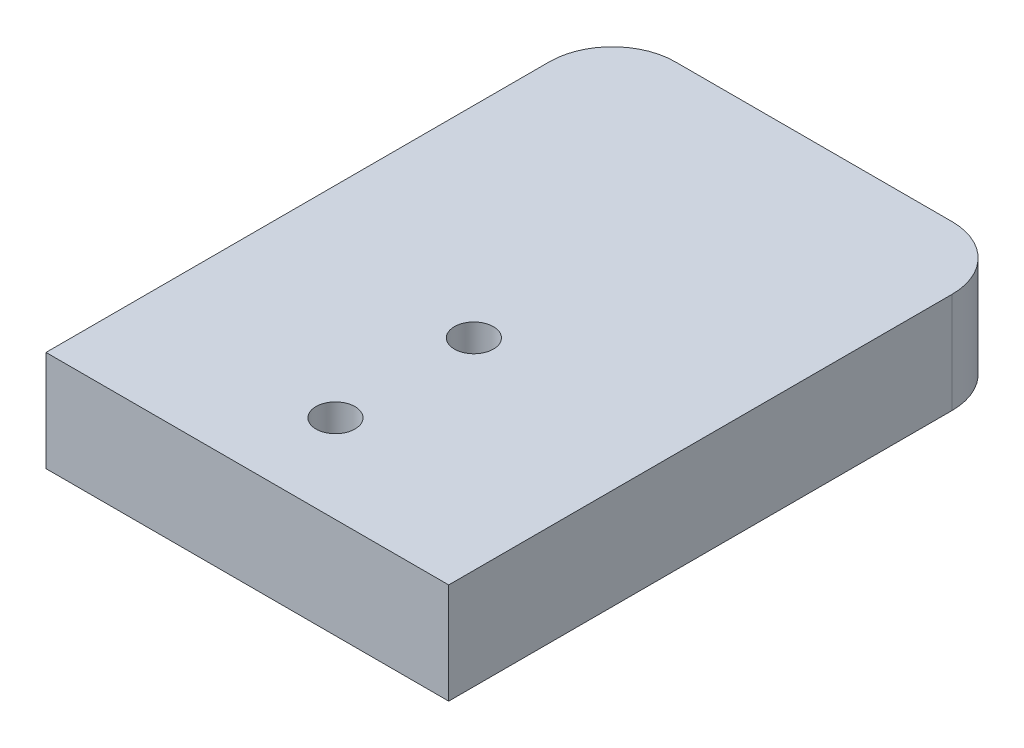
ISO-10303-21;
HEADER;
FILE_DESCRIPTION(('STEP AP214'),'2;1');
FILE_NAME('part.step','',(''),(''),'','','');
FILE_SCHEMA(('AUTOMOTIVE_DESIGN { 1 0 10303 214 1 1 1 1 }'));
ENDSEC;
DATA;
#1=APPLICATION_CONTEXT('core data for automotive mechanical design processes');
#2=APPLICATION_PROTOCOL_DEFINITION('international standard','automotive_design',2000,#1);
#3=PRODUCT_CONTEXT('',#1,'mechanical');
#4=PRODUCT('Part','Part','',(#3));
#5=PRODUCT_RELATED_PRODUCT_CATEGORY('part','',(#4));
#6=PRODUCT_DEFINITION_FORMATION('','',#4);
#7=PRODUCT_DEFINITION_CONTEXT('part definition',#1,'design');
#8=PRODUCT_DEFINITION('design','',#6,#7);
#9=PRODUCT_DEFINITION_SHAPE('','',#8);
#10=(LENGTH_UNIT() NAMED_UNIT(*) SI_UNIT(.MILLI.,.METRE.));
#11=(NAMED_UNIT(*) PLANE_ANGLE_UNIT() SI_UNIT($,.RADIAN.));
#12=(NAMED_UNIT(*) SI_UNIT($,.STERADIAN.) SOLID_ANGLE_UNIT());
#13=UNCERTAINTY_MEASURE_WITH_UNIT(LENGTH_MEASURE(1.E-05),#10,'distance_accuracy_value','');
#14=(GEOMETRIC_REPRESENTATION_CONTEXT(3) GLOBAL_UNCERTAINTY_ASSIGNED_CONTEXT((#13)) GLOBAL_UNIT_ASSIGNED_CONTEXT((#10,
#11,#12)) REPRESENTATION_CONTEXT('',''));
#15=CARTESIAN_POINT('',(0.,0.,0.));
#16=DIRECTION('',(0.,0.,1.));
#17=DIRECTION('',(1.,0.,0.));
#18=AXIS2_PLACEMENT_3D('',#15,#16,#17);
#19=CARTESIAN_POINT('',(1.67431578064992,2.8,18.4));
#20=DIRECTION('',(0.,0.,1.));
#21=DIRECTION('',(1.,0.,0.));
#22=AXIS2_PLACEMENT_3D('',#19,#20,#21);
#23=PLANE('',#22);
#24=DIRECTION('',(0.,1.,0.));
#25=VECTOR('',#24,1.);
#26=CARTESIAN_POINT('',(-1.67431578064991,2.8,18.4));
#27=LINE('',#26,#25);
#28=CARTESIAN_POINT('',(-1.67431578064991,0.,18.4));
#29=VERTEX_POINT('',#28);
#30=CARTESIAN_POINT('',(-1.67431578064991,2.8,18.4));
#31=VERTEX_POINT('',#30);
#32=EDGE_CURVE('E149',#29,#31,#27,.T.);
#33=ORIENTED_EDGE('',*,*,#32,.T.);
#34=DIRECTION('',(1.,0.,0.));
#35=VECTOR('',#34,1.);
#36=CARTESIAN_POINT('',(0.,2.8,18.4));
#37=LINE('',#36,#35);
#38=CARTESIAN_POINT('',(1.67431578064992,2.8,18.4));
#39=VERTEX_POINT('',#38);
#40=EDGE_CURVE('E204',#39,#31,#37,.F.);
#41=ORIENTED_EDGE('',*,*,#40,.F.);
#42=DIRECTION('',(0.,1.,0.));
#43=VECTOR('',#42,1.);
#44=CARTESIAN_POINT('',(1.67431578064992,2.8,18.4));
#45=LINE('',#44,#43);
#46=CARTESIAN_POINT('',(1.67431578064992,0.,18.4));
#47=VERTEX_POINT('',#46);
#48=EDGE_CURVE('E151',#39,#47,#45,.F.);
#49=ORIENTED_EDGE('',*,*,#48,.T.);
#50=DIRECTION('',(1.,0.,0.));
#51=VECTOR('',#50,1.);
#52=CARTESIAN_POINT('',(0.,0.,18.4));
#53=LINE('',#52,#51);
#54=EDGE_CURVE('E146',#47,#29,#53,.F.);
#55=ORIENTED_EDGE('',*,*,#54,.T.);
#56=EDGE_LOOP('',(#33,#41,#49,#55));
#57=FACE_BOUND('',#56,.T.);
#58=ADVANCED_FACE('F16',(#57),#23,.F.);
#59=CARTESIAN_POINT('',(-1.67431578064991,2.8,18.4));
#60=DIRECTION('',(-0.866025403784438,0.,0.5));
#61=DIRECTION('',(0.5,0.,0.866025403784438));
#62=AXIS2_PLACEMENT_3D('',#59,#60,#61);
#63=PLANE('',#62);
#64=DIRECTION('',(0.,1.,0.));
#65=VECTOR('',#64,1.);
#66=CARTESIAN_POINT('',(-3.34863156129983,2.8,15.5));
#67=LINE('',#66,#65);
#68=CARTESIAN_POINT('',(-3.34863156129983,0.,15.5));
#69=VERTEX_POINT('',#68);
#70=CARTESIAN_POINT('',(-3.34863156129983,2.8,15.5));
#71=VERTEX_POINT('',#70);
#72=EDGE_CURVE('E165',#69,#71,#67,.T.);
#73=ORIENTED_EDGE('',*,*,#72,.T.);
#74=DIRECTION('',(-0.5,0.,-0.866025403784438));
#75=VECTOR('',#74,1.);
#76=CARTESIAN_POINT('',(-1.67431578064991,2.8,18.4));
#77=LINE('',#76,#75);
#78=EDGE_CURVE('E163',#31,#71,#77,.T.);
#79=ORIENTED_EDGE('',*,*,#78,.F.);
#80=ORIENTED_EDGE('',*,*,#32,.F.);
#81=DIRECTION('',(-0.5,0.,-0.866025403784438));
#82=VECTOR('',#81,1.);
#83=CARTESIAN_POINT('',(-1.67431578064991,0.,18.4));
#84=LINE('',#83,#82);
#85=EDGE_CURVE('E156',#29,#69,#84,.T.);
#86=ORIENTED_EDGE('',*,*,#85,.T.);
#87=EDGE_LOOP('',(#73,#79,#80,#86));
#88=FACE_BOUND('',#87,.T.);
#89=ADVANCED_FACE('F160',(#88),#63,.F.);
#90=CARTESIAN_POINT('',(-3.34863156129983,2.8,15.5));
#91=DIRECTION('',(-0.866025403784439,0.,-0.5));
#92=DIRECTION('',(-0.5,0.,0.866025403784439));
#93=AXIS2_PLACEMENT_3D('',#90,#91,#92);
#94=PLANE('',#93);
#95=DIRECTION('',(0.,1.,0.));
#96=VECTOR('',#95,1.);
#97=CARTESIAN_POINT('',(-1.67431578064991,2.8,12.6));
#98=LINE('',#97,#96);
#99=CARTESIAN_POINT('',(-1.67431578064991,0.,12.6));
#100=VERTEX_POINT('',#99);
#101=CARTESIAN_POINT('',(-1.67431578064991,2.8,12.6));
#102=VERTEX_POINT('',#101);
#103=EDGE_CURVE('E228',#100,#102,#98,.T.);
#104=ORIENTED_EDGE('',*,*,#103,.T.);
#105=DIRECTION('',(0.5,0.,-0.866025403784438));
#106=VECTOR('',#105,1.);
#107=CARTESIAN_POINT('',(-3.34863156129983,2.8,15.5));
#108=LINE('',#107,#106);
#109=EDGE_CURVE('E200',#71,#102,#108,.T.);
#110=ORIENTED_EDGE('',*,*,#109,.F.);
#111=ORIENTED_EDGE('',*,*,#72,.F.);
#112=DIRECTION('',(0.5,0.,-0.866025403784438));
#113=VECTOR('',#112,1.);
#114=CARTESIAN_POINT('',(-3.34863156129983,0.,15.5));
#115=LINE('',#114,#113);
#116=EDGE_CURVE('E171',#69,#100,#115,.T.);
#117=ORIENTED_EDGE('',*,*,#116,.T.);
#118=EDGE_LOOP('',(#104,#110,#111,#117));
#119=FACE_BOUND('',#118,.T.);
#120=ADVANCED_FACE('F311',(#119),#94,.F.);
#121=CARTESIAN_POINT('',(-1.67431578064991,2.8,12.6));
#122=DIRECTION('',(0.,0.,-1.));
#123=DIRECTION('',(-1.,0.,0.));
#124=AXIS2_PLACEMENT_3D('',#121,#122,#123);
#125=PLANE('',#124);
#126=DIRECTION('',(0.,1.,0.));
#127=VECTOR('',#126,1.);
#128=CARTESIAN_POINT('',(1.67431578064992,2.8,12.6));
#129=LINE('',#128,#127);
#130=CARTESIAN_POINT('',(1.67431578064992,0.,12.6));
#131=VERTEX_POINT('',#130);
#132=CARTESIAN_POINT('',(1.67431578064992,2.8,12.6));
#133=VERTEX_POINT('',#132);
#134=EDGE_CURVE('E226',#131,#133,#129,.T.);
#135=ORIENTED_EDGE('',*,*,#134,.T.);
#136=DIRECTION('',(1.,0.,0.));
#137=VECTOR('',#136,1.);
#138=CARTESIAN_POINT('',(0.,2.8,12.6));
#139=LINE('',#138,#137);
#140=EDGE_CURVE('E157',#102,#133,#139,.T.);
#141=ORIENTED_EDGE('',*,*,#140,.F.);
#142=ORIENTED_EDGE('',*,*,#103,.F.);
#143=DIRECTION('',(1.,0.,0.));
#144=VECTOR('',#143,1.);
#145=CARTESIAN_POINT('',(0.,0.,12.6));
#146=LINE('',#145,#144);
#147=EDGE_CURVE('E173',#100,#131,#146,.T.);
#148=ORIENTED_EDGE('',*,*,#147,.T.);
#149=EDGE_LOOP('',(#135,#141,#142,#148));
#150=FACE_BOUND('',#149,.T.);
#151=ADVANCED_FACE('F297',(#150),#125,.F.);
#152=CARTESIAN_POINT('',(1.67431578064992,2.8,12.6));
#153=DIRECTION('',(0.866025403784439,0.,-0.5));
#154=DIRECTION('',(-0.5,0.,-0.866025403784439));
#155=AXIS2_PLACEMENT_3D('',#152,#153,#154);
#156=PLANE('',#155);
#157=DIRECTION('',(0.,1.,0.));
#158=VECTOR('',#157,1.);
#159=CARTESIAN_POINT('',(3.34863156129984,2.8,15.5));
#160=LINE('',#159,#158);
#161=CARTESIAN_POINT('',(3.34863156129984,0.,15.5));
#162=VERTEX_POINT('',#161);
#163=CARTESIAN_POINT('',(3.34863156129984,2.8,15.5));
#164=VERTEX_POINT('',#163);
#165=EDGE_CURVE('E224',#162,#164,#160,.T.);
#166=ORIENTED_EDGE('',*,*,#165,.T.);
#167=DIRECTION('',(0.5,0.,0.866025403784438));
#168=VECTOR('',#167,1.);
#169=CARTESIAN_POINT('',(1.67431578064992,2.8,12.6));
#170=LINE('',#169,#168);
#171=EDGE_CURVE('E209',#133,#164,#170,.T.);
#172=ORIENTED_EDGE('',*,*,#171,.F.);
#173=ORIENTED_EDGE('',*,*,#134,.F.);
#174=DIRECTION('',(0.5,0.,0.866025403784438));
#175=VECTOR('',#174,1.);
#176=CARTESIAN_POINT('',(1.67431578064992,0.,12.6));
#177=LINE('',#176,#175);
#178=EDGE_CURVE('E293',#131,#162,#177,.T.);
#179=ORIENTED_EDGE('',*,*,#178,.T.);
#180=EDGE_LOOP('',(#166,#172,#173,#179));
#181=FACE_BOUND('',#180,.T.);
#182=ADVANCED_FACE('F301',(#181),#156,.F.);
#183=CARTESIAN_POINT('',(3.34863156129984,2.8,15.5));
#184=DIRECTION('',(0.866025403784438,0.,0.5));
#185=DIRECTION('',(0.5,0.,-0.866025403784438));
#186=AXIS2_PLACEMENT_3D('',#183,#184,#185);
#187=PLANE('',#186);
#188=ORIENTED_EDGE('',*,*,#48,.F.);
#189=DIRECTION('',(-0.500000000000001,0.,0.866025403784438));
#190=VECTOR('',#189,1.);
#191=CARTESIAN_POINT('',(3.34863156129984,2.8,15.5));
#192=LINE('',#191,#190);
#193=EDGE_CURVE('E206',#164,#39,#192,.T.);
#194=ORIENTED_EDGE('',*,*,#193,.F.);
#195=ORIENTED_EDGE('',*,*,#165,.F.);
#196=DIRECTION('',(-0.500000000000001,0.,0.866025403784438));
#197=VECTOR('',#196,1.);
#198=CARTESIAN_POINT('',(3.34863156129984,0.,15.5));
#199=LINE('',#198,#197);
#200=EDGE_CURVE('E291',#162,#47,#199,.T.);
#201=ORIENTED_EDGE('',*,*,#200,.T.);
#202=EDGE_LOOP('',(#188,#194,#195,#201));
#203=FACE_BOUND('',#202,.T.);
#204=ADVANCED_FACE('F304',(#203),#187,.F.);
#205=CARTESIAN_POINT('',(-1.67431578064991,2.8,1.6));
#206=DIRECTION('',(0.,0.,-1.));
#207=DIRECTION('',(-1.,0.,0.));
#208=AXIS2_PLACEMENT_3D('',#205,#206,#207);
#209=PLANE('',#208);
#210=DIRECTION('',(0.,1.,0.));
#211=VECTOR('',#210,1.);
#212=CARTESIAN_POINT('',(1.67431578064992,2.8,1.6));
#213=LINE('',#212,#211);
#214=CARTESIAN_POINT('',(1.67431578064992,0.,1.6));
#215=VERTEX_POINT('',#214);
#216=CARTESIAN_POINT('',(1.67431578064992,2.8,1.6));
#217=VERTEX_POINT('',#216);
#218=EDGE_CURVE('E221',#215,#217,#213,.T.);
#219=ORIENTED_EDGE('',*,*,#218,.T.);
#220=DIRECTION('',(1.,0.,0.));
#221=VECTOR('',#220,1.);
#222=CARTESIAN_POINT('',(0.,2.8,1.6));
#223=LINE('',#222,#221);
#224=CARTESIAN_POINT('',(-1.67431578064991,2.8,1.6));
#225=VERTEX_POINT('',#224);
#226=EDGE_CURVE('E274',#225,#217,#223,.T.);
#227=ORIENTED_EDGE('',*,*,#226,.F.);
#228=DIRECTION('',(0.,1.,0.));
#229=VECTOR('',#228,1.);
#230=CARTESIAN_POINT('',(-1.67431578064991,2.8,1.6));
#231=LINE('',#230,#229);
#232=CARTESIAN_POINT('',(-1.67431578064991,0.,1.6));
#233=VERTEX_POINT('',#232);
#234=EDGE_CURVE('E212',#225,#233,#231,.F.);
#235=ORIENTED_EDGE('',*,*,#234,.T.);
#236=DIRECTION('',(1.,0.,0.));
#237=VECTOR('',#236,1.);
#238=CARTESIAN_POINT('',(0.,0.,1.6));
#239=LINE('',#238,#237);
#240=EDGE_CURVE('E280',#233,#215,#239,.T.);
#241=ORIENTED_EDGE('',*,*,#240,.T.);
#242=EDGE_LOOP('',(#219,#227,#235,#241));
#243=FACE_BOUND('',#242,.T.);
#244=ADVANCED_FACE('F384',(#243),#209,.F.);
#245=CARTESIAN_POINT('',(1.67431578064992,2.8,1.6));
#246=DIRECTION('',(0.866025403784439,0.,-0.5));
#247=DIRECTION('',(-0.5,0.,-0.866025403784439));
#248=AXIS2_PLACEMENT_3D('',#245,#246,#247);
#249=PLANE('',#248);
#250=DIRECTION('',(0.,1.,0.));
#251=VECTOR('',#250,1.);
#252=CARTESIAN_POINT('',(3.34863156129984,2.8,4.50000000000001));
#253=LINE('',#252,#251);
#254=CARTESIAN_POINT('',(3.34863156129984,0.,4.50000000000001));
#255=VERTEX_POINT('',#254);
#256=CARTESIAN_POINT('',(3.34863156129984,2.8,4.50000000000001));
#257=VERTEX_POINT('',#256);
#258=EDGE_CURVE('E219',#255,#257,#253,.T.);
#259=ORIENTED_EDGE('',*,*,#258,.T.);
#260=DIRECTION('',(0.5,0.,0.866025403784439));
#261=VECTOR('',#260,1.);
#262=CARTESIAN_POINT('',(1.67431578064992,2.8,1.6));
#263=LINE('',#262,#261);
#264=EDGE_CURVE('E271',#217,#257,#263,.T.);
#265=ORIENTED_EDGE('',*,*,#264,.F.);
#266=ORIENTED_EDGE('',*,*,#218,.F.);
#267=DIRECTION('',(0.5,0.,0.866025403784439));
#268=VECTOR('',#267,1.);
#269=CARTESIAN_POINT('',(1.67431578064992,0.,1.6));
#270=LINE('',#269,#268);
#271=EDGE_CURVE('E277',#215,#255,#270,.T.);
#272=ORIENTED_EDGE('',*,*,#271,.T.);
#273=EDGE_LOOP('',(#259,#265,#266,#272));
#274=FACE_BOUND('',#273,.T.);
#275=ADVANCED_FACE('F380',(#274),#249,.F.);
#276=CARTESIAN_POINT('',(3.34863156129984,2.8,4.50000000000001));
#277=DIRECTION('',(0.866025403784439,0.,0.5));
#278=DIRECTION('',(0.5,0.,-0.866025403784439));
#279=AXIS2_PLACEMENT_3D('',#276,#277,#278);
#280=PLANE('',#279);
#281=DIRECTION('',(0.,1.,0.));
#282=VECTOR('',#281,1.);
#283=CARTESIAN_POINT('',(1.67431578064992,2.8,7.40000000000001));
#284=LINE('',#283,#282);
#285=CARTESIAN_POINT('',(1.67431578064992,0.,7.40000000000001));
#286=VERTEX_POINT('',#285);
#287=CARTESIAN_POINT('',(1.67431578064992,2.8,7.40000000000001));
#288=VERTEX_POINT('',#287);
#289=EDGE_CURVE('E217',#286,#288,#284,.T.);
#290=ORIENTED_EDGE('',*,*,#289,.T.);
#291=DIRECTION('',(-0.5,0.,0.866025403784439));
#292=VECTOR('',#291,1.);
#293=CARTESIAN_POINT('',(3.34863156129984,2.8,4.50000000000001));
#294=LINE('',#293,#292);
#295=EDGE_CURVE('E268',#257,#288,#294,.T.);
#296=ORIENTED_EDGE('',*,*,#295,.F.);
#297=ORIENTED_EDGE('',*,*,#258,.F.);
#298=DIRECTION('',(-0.5,0.,0.866025403784439));
#299=VECTOR('',#298,1.);
#300=CARTESIAN_POINT('',(3.34863156129984,0.,4.50000000000001));
#301=LINE('',#300,#299);
#302=EDGE_CURVE('E289',#255,#286,#301,.T.);
#303=ORIENTED_EDGE('',*,*,#302,.T.);
#304=EDGE_LOOP('',(#290,#296,#297,#303));
#305=FACE_BOUND('',#304,.T.);
#306=ADVANCED_FACE('F376',(#305),#280,.F.);
#307=CARTESIAN_POINT('',(1.67431578064992,2.8,7.40000000000001));
#308=DIRECTION('',(0.,0.,1.));
#309=DIRECTION('',(1.,0.,0.));
#310=AXIS2_PLACEMENT_3D('',#307,#308,#309);
#311=PLANE('',#310);
#312=DIRECTION('',(0.,1.,0.));
#313=VECTOR('',#312,1.);
#314=CARTESIAN_POINT('',(-1.67431578064991,2.8,7.40000000000001));
#315=LINE('',#314,#313);
#316=CARTESIAN_POINT('',(-1.67431578064991,0.,7.40000000000001));
#317=VERTEX_POINT('',#316);
#318=CARTESIAN_POINT('',(-1.67431578064991,2.8,7.40000000000001));
#319=VERTEX_POINT('',#318);
#320=EDGE_CURVE('E215',#317,#319,#315,.T.);
#321=ORIENTED_EDGE('',*,*,#320,.T.);
#322=DIRECTION('',(1.,0.,0.));
#323=VECTOR('',#322,1.);
#324=CARTESIAN_POINT('',(0.,2.8,7.40000000000001));
#325=LINE('',#324,#323);
#326=EDGE_CURVE('E265',#288,#319,#325,.F.);
#327=ORIENTED_EDGE('',*,*,#326,.F.);
#328=ORIENTED_EDGE('',*,*,#289,.F.);
#329=DIRECTION('',(1.,0.,0.));
#330=VECTOR('',#329,1.);
#331=CARTESIAN_POINT('',(0.,0.,7.40000000000001));
#332=LINE('',#331,#330);
#333=EDGE_CURVE('E287',#286,#317,#332,.F.);
#334=ORIENTED_EDGE('',*,*,#333,.T.);
#335=EDGE_LOOP('',(#321,#327,#328,#334));
#336=FACE_BOUND('',#335,.T.);
#337=ADVANCED_FACE('F373',(#336),#311,.F.);
#338=CARTESIAN_POINT('',(-1.67431578064991,2.8,7.40000000000001));
#339=DIRECTION('',(-0.866025403784439,0.,0.5));
#340=DIRECTION('',(0.5,0.,0.866025403784439));
#341=AXIS2_PLACEMENT_3D('',#338,#339,#340);
#342=PLANE('',#341);
#343=DIRECTION('',(0.,1.,0.));
#344=VECTOR('',#343,1.);
#345=CARTESIAN_POINT('',(-3.34863156129983,2.8,4.50000000000001));
#346=LINE('',#345,#344);
#347=CARTESIAN_POINT('',(-3.34863156129983,0.,4.50000000000001));
#348=VERTEX_POINT('',#347);
#349=CARTESIAN_POINT('',(-3.34863156129983,2.8,4.50000000000001));
#350=VERTEX_POINT('',#349);
#351=EDGE_CURVE('E95',#348,#350,#346,.T.);
#352=ORIENTED_EDGE('',*,*,#351,.T.);
#353=DIRECTION('',(-0.5,0.,-0.866025403784438));
#354=VECTOR('',#353,1.);
#355=CARTESIAN_POINT('',(-1.67431578064991,2.8,7.40000000000001));
#356=LINE('',#355,#354);
#357=EDGE_CURVE('E262',#319,#350,#356,.T.);
#358=ORIENTED_EDGE('',*,*,#357,.F.);
#359=ORIENTED_EDGE('',*,*,#320,.F.);
#360=DIRECTION('',(-0.5,0.,-0.866025403784438));
#361=VECTOR('',#360,1.);
#362=CARTESIAN_POINT('',(-1.67431578064991,0.,7.40000000000001));
#363=LINE('',#362,#361);
#364=EDGE_CURVE('E285',#317,#348,#363,.T.);
#365=ORIENTED_EDGE('',*,*,#364,.T.);
#366=EDGE_LOOP('',(#352,#358,#359,#365));
#367=FACE_BOUND('',#366,.T.);
#368=ADVANCED_FACE('F369',(#367),#342,.F.);
#369=CARTESIAN_POINT('',(-3.34863156129983,2.8,4.50000000000001));
#370=DIRECTION('',(-0.866025403784439,0.,-0.5));
#371=DIRECTION('',(-0.5,0.,0.866025403784439));
#372=AXIS2_PLACEMENT_3D('',#369,#370,#371);
#373=PLANE('',#372);
#374=ORIENTED_EDGE('',*,*,#234,.F.);
#375=DIRECTION('',(0.5,0.,-0.866025403784439));
#376=VECTOR('',#375,1.);
#377=CARTESIAN_POINT('',(-3.34863156129983,2.8,4.50000000000001));
#378=LINE('',#377,#376);
#379=EDGE_CURVE('E259',#350,#225,#378,.T.);
#380=ORIENTED_EDGE('',*,*,#379,.F.);
#381=ORIENTED_EDGE('',*,*,#351,.F.);
#382=DIRECTION('',(0.5,0.,-0.866025403784439));
#383=VECTOR('',#382,1.);
#384=CARTESIAN_POINT('',(-3.34863156129983,0.,4.50000000000001));
#385=LINE('',#384,#383);
#386=EDGE_CURVE('E282',#348,#233,#385,.T.);
#387=ORIENTED_EDGE('',*,*,#386,.T.);
#388=EDGE_LOOP('',(#374,#380,#381,#387));
#389=FACE_BOUND('',#388,.T.);
#390=ADVANCED_FACE('F366',(#389),#373,.F.);
#391=CARTESIAN_POINT('',(0.,2.8,0.));
#392=DIRECTION('',(0.,-1.,0.));
#393=DIRECTION('',(0.,0.,-1.));
#394=AXIS2_PLACEMENT_3D('',#391,#392,#393);
#395=PLANE('',#394);
#396=ORIENTED_EDGE('',*,*,#109,.T.);
#397=ORIENTED_EDGE('',*,*,#140,.T.);
#398=ORIENTED_EDGE('',*,*,#171,.T.);
#399=ORIENTED_EDGE('',*,*,#193,.T.);
#400=ORIENTED_EDGE('',*,*,#40,.T.);
#401=ORIENTED_EDGE('',*,*,#78,.T.);
#402=EDGE_LOOP('',(#396,#397,#398,#399,#400,#401));
#403=FACE_BOUND('',#402,.T.);
#404=CARTESIAN_POINT('',(0.,2.8,15.5));
#405=DIRECTION('',(0.,-1.,0.));
#406=DIRECTION('',(0.,0.,-1.));
#407=AXIS2_PLACEMENT_3D('',#404,#405,#406);
#408=CIRCLE('',#407,1.55);
#409=CARTESIAN_POINT('',(0.,2.8,13.95));
#410=VERTEX_POINT('',#409);
#411=EDGE_CURVE('E19',#410,#410,#408,.F.);
#412=ORIENTED_EDGE('',*,*,#411,.T.);
#413=EDGE_LOOP('',(#412));
#414=FACE_BOUND('',#413,.T.);
#415=ADVANCED_FACE('F307',(#403,#414),#395,.T.);
#416=CARTESIAN_POINT('',(0.,0.,0.));
#417=DIRECTION('',(0.,1.,0.));
#418=DIRECTION('',(0.,0.,1.));
#419=AXIS2_PLACEMENT_3D('',#416,#417,#418);
#420=PLANE('',#419);
#421=CARTESIAN_POINT('',(11.,0.,-17.5));
#422=DIRECTION('',(0.,-1.,0.));
#423=DIRECTION('',(0.,0.,-1.));
#424=AXIS2_PLACEMENT_3D('',#421,#422,#423);
#425=CIRCLE('',#424,5.);
#426=CARTESIAN_POINT('',(16.,0.,-17.5));
#427=VERTEX_POINT('',#426);
#428=CARTESIAN_POINT('',(11.,0.,-22.5));
#429=VERTEX_POINT('',#428);
#430=EDGE_CURVE('E197',#427,#429,#425,.F.);
#431=ORIENTED_EDGE('',*,*,#430,.F.);
#432=DIRECTION('',(0.,0.,1.));
#433=VECTOR('',#432,1.);
#434=CARTESIAN_POINT('',(16.,0.,-22.5));
#435=LINE('',#434,#433);
#436=CARTESIAN_POINT('',(16.,0.,22.5));
#437=VERTEX_POINT('',#436);
#438=EDGE_CURVE('E85',#427,#437,#435,.T.);
#439=ORIENTED_EDGE('',*,*,#438,.T.);
#440=DIRECTION('',(-1.,0.,0.));
#441=VECTOR('',#440,1.);
#442=CARTESIAN_POINT('',(-16.,0.,22.5));
#443=LINE('',#442,#441);
#444=CARTESIAN_POINT('',(-16.,0.,22.5));
#445=VERTEX_POINT('',#444);
#446=EDGE_CURVE('E181',#437,#445,#443,.T.);
#447=ORIENTED_EDGE('',*,*,#446,.T.);
#448=DIRECTION('',(0.,0.,-1.));
#449=VECTOR('',#448,1.);
#450=CARTESIAN_POINT('',(-16.,0.,-22.5));
#451=LINE('',#450,#449);
#452=CARTESIAN_POINT('',(-16.,0.,-17.5));
#453=VERTEX_POINT('',#452);
#454=EDGE_CURVE('E188',#445,#453,#451,.T.);
#455=ORIENTED_EDGE('',*,*,#454,.T.);
#456=CARTESIAN_POINT('',(-11.,0.,-17.5));
#457=DIRECTION('',(0.,-1.,0.));
#458=DIRECTION('',(0.,0.,-1.));
#459=AXIS2_PLACEMENT_3D('',#456,#457,#458);
#460=CIRCLE('',#459,5.);
#461=CARTESIAN_POINT('',(-11.,0.,-22.5));
#462=VERTEX_POINT('',#461);
#463=EDGE_CURVE('E191',#462,#453,#460,.F.);
#464=ORIENTED_EDGE('',*,*,#463,.F.);
#465=DIRECTION('',(1.,0.,0.));
#466=VECTOR('',#465,1.);
#467=CARTESIAN_POINT('',(-16.,0.,-22.5));
#468=LINE('',#467,#466);
#469=EDGE_CURVE('E194',#462,#429,#468,.T.);
#470=ORIENTED_EDGE('',*,*,#469,.T.);
#471=EDGE_LOOP('',(#431,#439,#447,#455,#464,#470));
#472=FACE_BOUND('',#471,.T.);
#473=ORIENTED_EDGE('',*,*,#240,.F.);
#474=ORIENTED_EDGE('',*,*,#386,.F.);
#475=ORIENTED_EDGE('',*,*,#364,.F.);
#476=ORIENTED_EDGE('',*,*,#333,.F.);
#477=ORIENTED_EDGE('',*,*,#302,.F.);
#478=ORIENTED_EDGE('',*,*,#271,.F.);
#479=EDGE_LOOP('',(#473,#474,#475,#476,#477,#478));
#480=FACE_BOUND('',#479,.T.);
#481=ORIENTED_EDGE('',*,*,#178,.F.);
#482=ORIENTED_EDGE('',*,*,#147,.F.);
#483=ORIENTED_EDGE('',*,*,#116,.F.);
#484=ORIENTED_EDGE('',*,*,#85,.F.);
#485=ORIENTED_EDGE('',*,*,#54,.F.);
#486=ORIENTED_EDGE('',*,*,#200,.F.);
#487=EDGE_LOOP('',(#481,#482,#483,#484,#485,#486));
#488=FACE_BOUND('',#487,.T.);
#489=ADVANCED_FACE('F169',(#472,#480,#488),#420,.F.);
#490=CARTESIAN_POINT('',(0.,2.8,0.));
#491=DIRECTION('',(0.,-1.,0.));
#492=DIRECTION('',(0.,0.,-1.));
#493=AXIS2_PLACEMENT_3D('',#490,#491,#492);
#494=PLANE('',#493);
#495=ORIENTED_EDGE('',*,*,#357,.T.);
#496=ORIENTED_EDGE('',*,*,#379,.T.);
#497=ORIENTED_EDGE('',*,*,#226,.T.);
#498=ORIENTED_EDGE('',*,*,#264,.T.);
#499=ORIENTED_EDGE('',*,*,#295,.T.);
#500=ORIENTED_EDGE('',*,*,#326,.T.);
#501=EDGE_LOOP('',(#495,#496,#497,#498,#499,#500));
#502=FACE_BOUND('',#501,.T.);
#503=CARTESIAN_POINT('',(0.,2.8,4.50000000000001));
#504=DIRECTION('',(0.,-1.,0.));
#505=DIRECTION('',(0.,0.,-1.));
#506=AXIS2_PLACEMENT_3D('',#503,#504,#505);
#507=CIRCLE('',#506,1.55);
#508=CARTESIAN_POINT('',(0.,2.8,2.95000000000001));
#509=VERTEX_POINT('',#508);
#510=EDGE_CURVE('E184',#509,#509,#507,.F.);
#511=ORIENTED_EDGE('',*,*,#510,.T.);
#512=EDGE_LOOP('',(#511));
#513=FACE_BOUND('',#512,.T.);
#514=ADVANCED_FACE('F356',(#502,#513),#494,.T.);
#515=CARTESIAN_POINT('',(0.,8.,15.5));
#516=DIRECTION('',(0.,-1.,0.));
#517=DIRECTION('',(0.,0.,-1.));
#518=AXIS2_PLACEMENT_3D('',#515,#516,#517);
#519=CYLINDRICAL_SURFACE('',#518,1.55);
#520=CARTESIAN_POINT('',(0.,8.,15.5));
#521=DIRECTION('',(0.,-1.,0.));
#522=DIRECTION('',(0.,0.,-1.));
#523=AXIS2_PLACEMENT_3D('',#520,#521,#522);
#524=CIRCLE('',#523,1.55);
#525=CARTESIAN_POINT('',(0.,8.,13.95));
#526=VERTEX_POINT('',#525);
#527=EDGE_CURVE('E240',#526,#526,#524,.T.);
#528=ORIENTED_EDGE('',*,*,#527,.F.);
#529=EDGE_LOOP('',(#528));
#530=FACE_BOUND('',#529,.T.);
#531=ORIENTED_EDGE('',*,*,#411,.F.);
#532=EDGE_LOOP('',(#531));
#533=FACE_BOUND('',#532,.T.);
#534=ADVANCED_FACE('F353',(#530,#533),#519,.F.);
#535=CARTESIAN_POINT('',(16.,8.,-22.5));
#536=DIRECTION('',(-1.,0.,0.));
#537=DIRECTION('',(0.,0.,1.));
#538=AXIS2_PLACEMENT_3D('',#535,#536,#537);
#539=PLANE('',#538);
#540=DIRECTION('',(0.,-1.,0.));
#541=VECTOR('',#540,1.);
#542=CARTESIAN_POINT('',(16.,8.,-17.5));
#543=LINE('',#542,#541);
#544=CARTESIAN_POINT('',(16.,8.,-17.5));
#545=VERTEX_POINT('',#544);
#546=EDGE_CURVE('E178',#545,#427,#543,.T.);
#547=ORIENTED_EDGE('',*,*,#546,.F.);
#548=DIRECTION('',(0.,0.,1.));
#549=VECTOR('',#548,1.);
#550=CARTESIAN_POINT('',(16.,8.,0.));
#551=LINE('',#550,#549);
#552=CARTESIAN_POINT('',(16.,8.,22.5));
#553=VERTEX_POINT('',#552);
#554=EDGE_CURVE('E239',#553,#545,#551,.F.);
#555=ORIENTED_EDGE('',*,*,#554,.F.);
#556=DIRECTION('',(0.,1.,0.));
#557=VECTOR('',#556,1.);
#558=CARTESIAN_POINT('',(16.,8.,22.5));
#559=LINE('',#558,#557);
#560=EDGE_CURVE('E185',#553,#437,#559,.F.);
#561=ORIENTED_EDGE('',*,*,#560,.T.);
#562=ORIENTED_EDGE('',*,*,#438,.F.);
#563=EDGE_LOOP('',(#547,#555,#561,#562));
#564=FACE_BOUND('',#563,.T.);
#565=ADVANCED_FACE('F350',(#564),#539,.F.);
#566=CARTESIAN_POINT('',(11.,8.,-17.5));
#567=DIRECTION('',(0.,-1.,0.));
#568=DIRECTION('',(0.,0.,-1.));
#569=AXIS2_PLACEMENT_3D('',#566,#567,#568);
#570=CYLINDRICAL_SURFACE('',#569,5.);
#571=ORIENTED_EDGE('',*,*,#430,.T.);
#572=DIRECTION('',(0.,1.,0.));
#573=VECTOR('',#572,1.);
#574=CARTESIAN_POINT('',(11.,8.,-22.5));
#575=LINE('',#574,#573);
#576=CARTESIAN_POINT('',(11.,8.,-22.5));
#577=VERTEX_POINT('',#576);
#578=EDGE_CURVE('E196',#429,#577,#575,.T.);
#579=ORIENTED_EDGE('',*,*,#578,.T.);
#580=CARTESIAN_POINT('',(11.,8.,-17.5));
#581=DIRECTION('',(0.,-1.,0.));
#582=DIRECTION('',(0.,0.,-1.));
#583=AXIS2_PLACEMENT_3D('',#580,#581,#582);
#584=CIRCLE('',#583,5.);
#585=EDGE_CURVE('E236',#545,#577,#584,.F.);
#586=ORIENTED_EDGE('',*,*,#585,.F.);
#587=ORIENTED_EDGE('',*,*,#546,.T.);
#588=EDGE_LOOP('',(#571,#579,#586,#587));
#589=FACE_BOUND('',#588,.T.);
#590=ADVANCED_FACE('F346',(#589),#570,.T.);
#591=CARTESIAN_POINT('',(-16.,8.,-22.5));
#592=DIRECTION('',(0.,0.,1.));
#593=DIRECTION('',(1.,0.,0.));
#594=AXIS2_PLACEMENT_3D('',#591,#592,#593);
#595=PLANE('',#594);
#596=ORIENTED_EDGE('',*,*,#578,.F.);
#597=ORIENTED_EDGE('',*,*,#469,.F.);
#598=DIRECTION('',(0.,-1.,0.));
#599=VECTOR('',#598,1.);
#600=CARTESIAN_POINT('',(-11.,8.,-22.5));
#601=LINE('',#600,#599);
#602=CARTESIAN_POINT('',(-11.,8.,-22.5));
#603=VERTEX_POINT('',#602);
#604=EDGE_CURVE('E246',#603,#462,#601,.T.);
#605=ORIENTED_EDGE('',*,*,#604,.F.);
#606=DIRECTION('',(1.,0.,0.));
#607=VECTOR('',#606,1.);
#608=CARTESIAN_POINT('',(0.,8.,-22.5));
#609=LINE('',#608,#607);
#610=EDGE_CURVE('E235',#577,#603,#609,.F.);
#611=ORIENTED_EDGE('',*,*,#610,.F.);
#612=EDGE_LOOP('',(#596,#597,#605,#611));
#613=FACE_BOUND('',#612,.T.);
#614=ADVANCED_FACE('F342',(#613),#595,.F.);
#615=CARTESIAN_POINT('',(-11.,8.,-17.5));
#616=DIRECTION('',(0.,-1.,0.));
#617=DIRECTION('',(0.,0.,-1.));
#618=AXIS2_PLACEMENT_3D('',#615,#616,#617);
#619=CYLINDRICAL_SURFACE('',#618,5.);
#620=ORIENTED_EDGE('',*,*,#463,.T.);
#621=DIRECTION('',(0.,1.,0.));
#622=VECTOR('',#621,1.);
#623=CARTESIAN_POINT('',(-16.,8.,-17.5));
#624=LINE('',#623,#622);
#625=CARTESIAN_POINT('',(-16.,8.,-17.5));
#626=VERTEX_POINT('',#625);
#627=EDGE_CURVE('E190',#453,#626,#624,.T.);
#628=ORIENTED_EDGE('',*,*,#627,.T.);
#629=CARTESIAN_POINT('',(-11.,8.,-17.5));
#630=DIRECTION('',(0.,-1.,0.));
#631=DIRECTION('',(0.,0.,-1.));
#632=AXIS2_PLACEMENT_3D('',#629,#630,#631);
#633=CIRCLE('',#632,5.);
#634=EDGE_CURVE('E231',#603,#626,#633,.F.);
#635=ORIENTED_EDGE('',*,*,#634,.F.);
#636=ORIENTED_EDGE('',*,*,#604,.T.);
#637=EDGE_LOOP('',(#620,#628,#635,#636));
#638=FACE_BOUND('',#637,.T.);
#639=ADVANCED_FACE('F339',(#638),#619,.T.);
#640=CARTESIAN_POINT('',(-16.,8.,-22.5));
#641=DIRECTION('',(1.,0.,0.));
#642=DIRECTION('',(0.,0.,-1.));
#643=AXIS2_PLACEMENT_3D('',#640,#641,#642);
#644=PLANE('',#643);
#645=ORIENTED_EDGE('',*,*,#627,.F.);
#646=ORIENTED_EDGE('',*,*,#454,.F.);
#647=DIRECTION('',(0.,1.,0.));
#648=VECTOR('',#647,1.);
#649=CARTESIAN_POINT('',(-16.,8.,22.5));
#650=LINE('',#649,#648);
#651=CARTESIAN_POINT('',(-16.,8.,22.5));
#652=VERTEX_POINT('',#651);
#653=EDGE_CURVE('E34',#445,#652,#650,.T.);
#654=ORIENTED_EDGE('',*,*,#653,.T.);
#655=DIRECTION('',(0.,0.,1.));
#656=VECTOR('',#655,1.);
#657=CARTESIAN_POINT('',(-16.,8.,0.));
#658=LINE('',#657,#656);
#659=EDGE_CURVE('E234',#626,#652,#658,.T.);
#660=ORIENTED_EDGE('',*,*,#659,.F.);
#661=EDGE_LOOP('',(#645,#646,#654,#660));
#662=FACE_BOUND('',#661,.T.);
#663=ADVANCED_FACE('F335',(#662),#644,.F.);
#664=CARTESIAN_POINT('',(-16.,8.,22.5));
#665=DIRECTION('',(0.,0.,-1.));
#666=DIRECTION('',(-1.,0.,0.));
#667=AXIS2_PLACEMENT_3D('',#664,#665,#666);
#668=PLANE('',#667);
#669=ORIENTED_EDGE('',*,*,#560,.F.);
#670=DIRECTION('',(1.,0.,0.));
#671=VECTOR('',#670,1.);
#672=CARTESIAN_POINT('',(0.,8.,22.5));
#673=LINE('',#672,#671);
#674=EDGE_CURVE('E25',#652,#553,#673,.T.);
#675=ORIENTED_EDGE('',*,*,#674,.F.);
#676=ORIENTED_EDGE('',*,*,#653,.F.);
#677=ORIENTED_EDGE('',*,*,#446,.F.);
#678=EDGE_LOOP('',(#669,#675,#676,#677));
#679=FACE_BOUND('',#678,.T.);
#680=ADVANCED_FACE('F328',(#679),#668,.F.);
#681=CARTESIAN_POINT('',(0.,8.,4.50000000000001));
#682=DIRECTION('',(0.,-1.,0.));
#683=DIRECTION('',(0.,0.,-1.));
#684=AXIS2_PLACEMENT_3D('',#681,#682,#683);
#685=CYLINDRICAL_SURFACE('',#684,1.55);
#686=CARTESIAN_POINT('',(0.,8.,4.50000000000001));
#687=DIRECTION('',(0.,-1.,0.));
#688=DIRECTION('',(0.,0.,-1.));
#689=AXIS2_PLACEMENT_3D('',#686,#687,#688);
#690=CIRCLE('',#689,1.55);
#691=CARTESIAN_POINT('',(0.,8.,2.95000000000001));
#692=VERTEX_POINT('',#691);
#693=EDGE_CURVE('E11',#692,#692,#690,.T.);
#694=ORIENTED_EDGE('',*,*,#693,.F.);
#695=EDGE_LOOP('',(#694));
#696=FACE_BOUND('',#695,.T.);
#697=ORIENTED_EDGE('',*,*,#510,.F.);
#698=EDGE_LOOP('',(#697));
#699=FACE_BOUND('',#698,.T.);
#700=ADVANCED_FACE('F322',(#696,#699),#685,.F.);
#701=CARTESIAN_POINT('',(0.,8.,0.));
#702=DIRECTION('',(0.,1.,0.));
#703=DIRECTION('',(0.,0.,1.));
#704=AXIS2_PLACEMENT_3D('',#701,#702,#703);
#705=PLANE('',#704);
#706=ORIENTED_EDGE('',*,*,#693,.T.);
#707=EDGE_LOOP('',(#706));
#708=FACE_BOUND('',#707,.T.);
#709=ORIENTED_EDGE('',*,*,#659,.T.);
#710=ORIENTED_EDGE('',*,*,#674,.T.);
#711=ORIENTED_EDGE('',*,*,#554,.T.);
#712=ORIENTED_EDGE('',*,*,#585,.T.);
#713=ORIENTED_EDGE('',*,*,#610,.T.);
#714=ORIENTED_EDGE('',*,*,#634,.T.);
#715=EDGE_LOOP('',(#709,#710,#711,#712,#713,#714));
#716=FACE_BOUND('',#715,.T.);
#717=ORIENTED_EDGE('',*,*,#527,.T.);
#718=EDGE_LOOP('',(#717));
#719=FACE_BOUND('',#718,.T.);
#720=ADVANCED_FACE('F320',(#708,#716,#719),#705,.T.);
#721=CLOSED_SHELL('',(#58,#89,#120,#151,#182,#204,#244,#275,#306,#337,#368,#390,#415,#489,#514,
#534,#565,#590,#614,#639,#663,#680,#700,#720));
#722=MANIFOLD_SOLID_BREP('B1',#721);
#723=ADVANCED_BREP_SHAPE_REPRESENTATION('',(#18,#722),#14);
#724=SHAPE_DEFINITION_REPRESENTATION(#9,#723);
ENDSEC;
END-ISO-10303-21;
